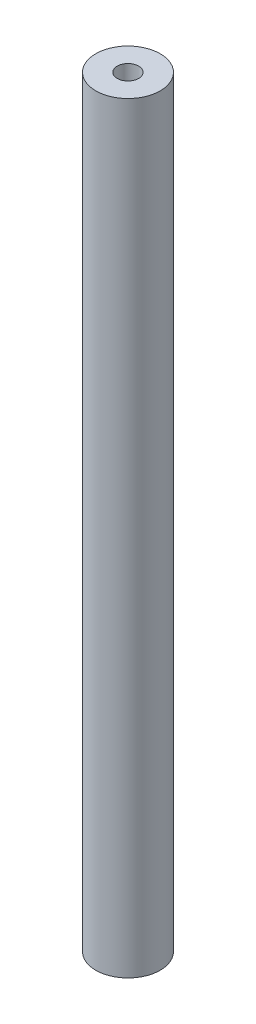
ISO-10303-21;
HEADER;
FILE_DESCRIPTION(('STEP AP214'),'2;1');
FILE_NAME('part.step','',(''),(''),'','','');
FILE_SCHEMA(('AUTOMOTIVE_DESIGN { 1 0 10303 214 1 1 1 1 }'));
ENDSEC;
DATA;
#1=APPLICATION_CONTEXT('core data for automotive mechanical design processes');
#2=APPLICATION_PROTOCOL_DEFINITION('international standard','automotive_design',2000,#1);
#3=PRODUCT_CONTEXT('',#1,'mechanical');
#4=PRODUCT('Part','Part','',(#3));
#5=PRODUCT_RELATED_PRODUCT_CATEGORY('part','',(#4));
#6=PRODUCT_DEFINITION_FORMATION('','',#4);
#7=PRODUCT_DEFINITION_CONTEXT('part definition',#1,'design');
#8=PRODUCT_DEFINITION('design','',#6,#7);
#9=PRODUCT_DEFINITION_SHAPE('','',#8);
#10=(LENGTH_UNIT() NAMED_UNIT(*) SI_UNIT(.MILLI.,.METRE.));
#11=(NAMED_UNIT(*) PLANE_ANGLE_UNIT() SI_UNIT($,.RADIAN.));
#12=(NAMED_UNIT(*) SI_UNIT($,.STERADIAN.) SOLID_ANGLE_UNIT());
#13=UNCERTAINTY_MEASURE_WITH_UNIT(LENGTH_MEASURE(1.E-05),#10,'distance_accuracy_value','');
#14=(GEOMETRIC_REPRESENTATION_CONTEXT(3) GLOBAL_UNCERTAINTY_ASSIGNED_CONTEXT((#13)) GLOBAL_UNIT_ASSIGNED_CONTEXT((#10,
#11,#12)) REPRESENTATION_CONTEXT('',''));
#15=CARTESIAN_POINT('',(0.,0.,0.));
#16=DIRECTION('',(0.,0.,1.));
#17=DIRECTION('',(1.,0.,0.));
#18=AXIS2_PLACEMENT_3D('',#15,#16,#17);
#19=CARTESIAN_POINT('',(0.,71.,0.));
#20=DIRECTION('',(0.,-1.,0.));
#21=DIRECTION('',(0.,0.,-1.));
#22=AXIS2_PLACEMENT_3D('',#19,#20,#21);
#23=CYLINDRICAL_SURFACE('',#22,3.);
#24=CARTESIAN_POINT('',(0.,71.,0.));
#25=DIRECTION('',(0.,1.,0.));
#26=DIRECTION('',(0.,0.,1.));
#27=AXIS2_PLACEMENT_3D('',#24,#25,#26);
#28=CIRCLE('',#27,3.);
#29=CARTESIAN_POINT('',(0.,71.,3.));
#30=VERTEX_POINT('',#29);
#31=EDGE_CURVE('E10',#30,#30,#28,.T.);
#32=ORIENTED_EDGE('',*,*,#31,.F.);
#33=EDGE_LOOP('',(#32));
#34=FACE_BOUND('',#33,.T.);
#35=CARTESIAN_POINT('',(0.,0.,0.));
#36=DIRECTION('',(0.,1.,0.));
#37=DIRECTION('',(0.,0.,1.));
#38=AXIS2_PLACEMENT_3D('',#35,#36,#37);
#39=CIRCLE('',#38,3.);
#40=CARTESIAN_POINT('',(0.,0.,3.));
#41=VERTEX_POINT('',#40);
#42=EDGE_CURVE('E33',#41,#41,#39,.T.);
#43=ORIENTED_EDGE('',*,*,#42,.T.);
#44=EDGE_LOOP('',(#43));
#45=FACE_BOUND('',#44,.T.);
#46=ADVANCED_FACE('F30',(#34,#45),#23,.T.);
#47=CARTESIAN_POINT('',(0.,71.,0.));
#48=DIRECTION('',(0.,1.,0.));
#49=DIRECTION('',(0.,0.,1.));
#50=AXIS2_PLACEMENT_3D('',#47,#48,#49);
#51=PLANE('',#50);
#52=CARTESIAN_POINT('',(0.,71.,0.));
#53=DIRECTION('',(0.,1.,0.));
#54=DIRECTION('',(0.,0.,1.));
#55=AXIS2_PLACEMENT_3D('',#52,#53,#54);
#56=CIRCLE('',#55,1.);
#57=CARTESIAN_POINT('',(0.,71.,1.));
#58=VERTEX_POINT('',#57);
#59=EDGE_CURVE('E42',#58,#58,#56,.T.);
#60=ORIENTED_EDGE('',*,*,#59,.F.);
#61=EDGE_LOOP('',(#60));
#62=FACE_BOUND('',#61,.T.);
#63=ORIENTED_EDGE('',*,*,#31,.T.);
#64=EDGE_LOOP('',(#63));
#65=FACE_BOUND('',#64,.T.);
#66=ADVANCED_FACE('F67',(#62,#65),#51,.T.);
#67=CARTESIAN_POINT('',(0.,0.,0.));
#68=DIRECTION('',(0.,1.,0.));
#69=DIRECTION('',(0.,0.,1.));
#70=AXIS2_PLACEMENT_3D('',#67,#68,#69);
#71=PLANE('',#70);
#72=CARTESIAN_POINT('',(0.,0.,0.));
#73=DIRECTION('',(0.,-1.,0.));
#74=DIRECTION('',(0.,0.,-1.));
#75=AXIS2_PLACEMENT_3D('',#72,#73,#74);
#76=CIRCLE('',#75,1.);
#77=CARTESIAN_POINT('',(0.,0.,-1.));
#78=VERTEX_POINT('',#77);
#79=EDGE_CURVE('E48',#78,#78,#76,.T.);
#80=ORIENTED_EDGE('',*,*,#79,.F.);
#81=EDGE_LOOP('',(#80));
#82=FACE_BOUND('',#81,.T.);
#83=ORIENTED_EDGE('',*,*,#42,.F.);
#84=EDGE_LOOP('',(#83));
#85=FACE_BOUND('',#84,.T.);
#86=ADVANCED_FACE('F63',(#82,#85),#71,.F.);
#87=CARTESIAN_POINT('',(0.,68.,0.));
#88=DIRECTION('',(0.,1.,0.));
#89=DIRECTION('',(0.,0.,1.));
#90=AXIS2_PLACEMENT_3D('',#87,#88,#89);
#91=CYLINDRICAL_SURFACE('',#90,1.);
#92=CARTESIAN_POINT('',(0.,68.,0.));
#93=DIRECTION('',(0.,1.,0.));
#94=DIRECTION('',(0.,0.,1.));
#95=AXIS2_PLACEMENT_3D('',#92,#93,#94);
#96=CIRCLE('',#95,1.);
#97=CARTESIAN_POINT('',(0.,68.,1.));
#98=VERTEX_POINT('',#97);
#99=EDGE_CURVE('E40',#98,#98,#96,.T.);
#100=ORIENTED_EDGE('',*,*,#99,.F.);
#101=EDGE_LOOP('',(#100));
#102=FACE_BOUND('',#101,.T.);
#103=ORIENTED_EDGE('',*,*,#59,.T.);
#104=EDGE_LOOP('',(#103));
#105=FACE_BOUND('',#104,.T.);
#106=ADVANCED_FACE('F66',(#102,#105),#91,.F.);
#107=CARTESIAN_POINT('',(0.,68.,0.));
#108=DIRECTION('',(0.,1.,0.));
#109=DIRECTION('',(0.,0.,1.));
#110=AXIS2_PLACEMENT_3D('',#107,#108,#109);
#111=PLANE('',#110);
#112=ORIENTED_EDGE('',*,*,#99,.T.);
#113=EDGE_LOOP('',(#112));
#114=FACE_BOUND('',#113,.T.);
#115=ADVANCED_FACE('F59',(#114),#111,.T.);
#116=CARTESIAN_POINT('',(0.,3.,0.));
#117=DIRECTION('',(0.,-1.,0.));
#118=DIRECTION('',(0.,0.,-1.));
#119=AXIS2_PLACEMENT_3D('',#116,#117,#118);
#120=CYLINDRICAL_SURFACE('',#119,1.);
#121=CARTESIAN_POINT('',(0.,3.,0.));
#122=DIRECTION('',(0.,-1.,0.));
#123=DIRECTION('',(0.,0.,-1.));
#124=AXIS2_PLACEMENT_3D('',#121,#122,#123);
#125=CIRCLE('',#124,1.);
#126=CARTESIAN_POINT('',(0.,3.,-1.));
#127=VERTEX_POINT('',#126);
#128=EDGE_CURVE('E45',#127,#127,#125,.T.);
#129=ORIENTED_EDGE('',*,*,#128,.F.);
#130=EDGE_LOOP('',(#129));
#131=FACE_BOUND('',#130,.T.);
#132=ORIENTED_EDGE('',*,*,#79,.T.);
#133=EDGE_LOOP('',(#132));
#134=FACE_BOUND('',#133,.T.);
#135=ADVANCED_FACE('F56',(#131,#134),#120,.F.);
#136=CARTESIAN_POINT('',(0.,3.,0.));
#137=DIRECTION('',(0.,-1.,0.));
#138=DIRECTION('',(0.,0.,-1.));
#139=AXIS2_PLACEMENT_3D('',#136,#137,#138);
#140=PLANE('',#139);
#141=ORIENTED_EDGE('',*,*,#128,.T.);
#142=EDGE_LOOP('',(#141));
#143=FACE_BOUND('',#142,.T.);
#144=ADVANCED_FACE('F54',(#143),#140,.T.);
#145=CLOSED_SHELL('',(#46,#66,#86,#106,#115,#135,#144));
#146=MANIFOLD_SOLID_BREP('B2',#145);
#147=ADVANCED_BREP_SHAPE_REPRESENTATION('',(#18,#146),#14);
#148=SHAPE_DEFINITION_REPRESENTATION(#9,#147);
ENDSEC;
END-ISO-10303-21;
